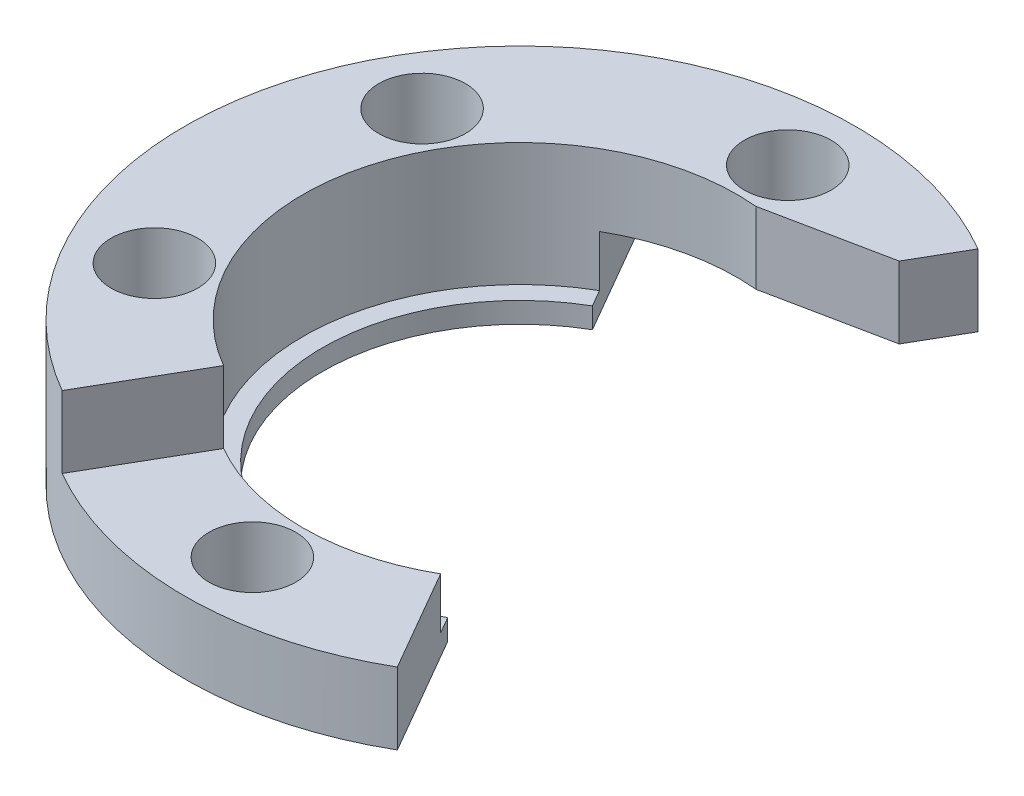
ISO-10303-21;
HEADER;
FILE_DESCRIPTION(('STEP AP214'),'2;1');
FILE_NAME('part.step','',(''),(''),'','','');
FILE_SCHEMA(('AUTOMOTIVE_DESIGN { 1 0 10303 214 1 1 1 1 }'));
ENDSEC;
DATA;
#1=APPLICATION_CONTEXT('core data for automotive mechanical design processes');
#2=APPLICATION_PROTOCOL_DEFINITION('international standard','automotive_design',2000,#1);
#3=PRODUCT_CONTEXT('',#1,'mechanical');
#4=PRODUCT('Part','Part','',(#3));
#5=PRODUCT_RELATED_PRODUCT_CATEGORY('part','',(#4));
#6=PRODUCT_DEFINITION_FORMATION('','',#4);
#7=PRODUCT_DEFINITION_CONTEXT('part definition',#1,'design');
#8=PRODUCT_DEFINITION('design','',#6,#7);
#9=PRODUCT_DEFINITION_SHAPE('','',#8);
#10=(LENGTH_UNIT() NAMED_UNIT(*) SI_UNIT(.MILLI.,.METRE.));
#11=(NAMED_UNIT(*) PLANE_ANGLE_UNIT() SI_UNIT($,.RADIAN.));
#12=(NAMED_UNIT(*) SI_UNIT($,.STERADIAN.) SOLID_ANGLE_UNIT());
#13=UNCERTAINTY_MEASURE_WITH_UNIT(LENGTH_MEASURE(1.E-05),#10,'distance_accuracy_value','');
#14=(GEOMETRIC_REPRESENTATION_CONTEXT(3) GLOBAL_UNCERTAINTY_ASSIGNED_CONTEXT((#13)) GLOBAL_UNIT_ASSIGNED_CONTEXT((#10,
#11,#12)) REPRESENTATION_CONTEXT('',''));
#15=CARTESIAN_POINT('',(0.,0.,0.));
#16=DIRECTION('',(0.,0.,1.));
#17=DIRECTION('',(1.,0.,0.));
#18=AXIS2_PLACEMENT_3D('',#15,#16,#17);
#19=CARTESIAN_POINT('',(0.,7.239,0.));
#20=DIRECTION('',(0.,-1.,0.));
#21=DIRECTION('',(0.,0.,-1.));
#22=AXIS2_PLACEMENT_3D('',#19,#20,#21);
#23=CYLINDRICAL_SURFACE('',#22,10.9347);
#24=DIRECTION('',(0.,-1.,0.));
#25=VECTOR('',#24,1.);
#26=CARTESIAN_POINT('',(0.998562219051619,7.239,-10.889009945109));
#27=LINE('',#26,#25);
#28=CARTESIAN_POINT('',(0.998562219051619,7.239,-10.889009945109));
#29=VERTEX_POINT('',#28);
#30=CARTESIAN_POINT('',(0.998562219051616,3.6195,-10.889009945109));
#31=VERTEX_POINT('',#30);
#32=EDGE_CURVE('E46',#29,#31,#27,.T.);
#33=ORIENTED_EDGE('',*,*,#32,.F.);
#34=CARTESIAN_POINT('',(0.,7.239,0.));
#35=DIRECTION('',(0.,-1.,0.));
#36=DIRECTION('',(0.,0.,-1.));
#37=AXIS2_PLACEMENT_3D('',#34,#35,#36);
#38=CIRCLE('',#37,10.9347);
#39=CARTESIAN_POINT('',(-5.46734999999996,7.239,9.46972798276173));
#40=VERTEX_POINT('',#39);
#41=EDGE_CURVE('E128',#40,#29,#38,.T.);
#42=ORIENTED_EDGE('',*,*,#41,.F.);
#43=DIRECTION('',(0.,-1.,0.));
#44=VECTOR('',#43,1.);
#45=CARTESIAN_POINT('',(-5.46734999999995,7.239,9.46972798276173));
#46=LINE('',#45,#44);
#47=CARTESIAN_POINT('',(-5.46734999999996,3.6195,9.46972798276173));
#48=VERTEX_POINT('',#47);
#49=EDGE_CURVE('E134',#40,#48,#46,.T.);
#50=ORIENTED_EDGE('',*,*,#49,.T.);
#51=CARTESIAN_POINT('',(0.,3.6195,0.));
#52=DIRECTION('',(0.,-1.,0.));
#53=DIRECTION('',(0.,0.,-1.));
#54=AXIS2_PLACEMENT_3D('',#51,#52,#53);
#55=CIRCLE('',#54,10.9347);
#56=CARTESIAN_POINT('',(5.46735,3.6195,9.46972798276172));
#57=VERTEX_POINT('',#56);
#58=EDGE_CURVE('E217',#48,#57,#55,.F.);
#59=ORIENTED_EDGE('',*,*,#58,.T.);
#60=DIRECTION('',(0.,-1.,0.));
#61=VECTOR('',#60,1.);
#62=CARTESIAN_POINT('',(5.46734999999998,7.239,9.46972798276172));
#63=LINE('',#62,#61);
#64=CARTESIAN_POINT('',(5.46734999999998,1.0414,9.46972798276172));
#65=VERTEX_POINT('',#64);
#66=EDGE_CURVE('E146',#57,#65,#63,.T.);
#67=ORIENTED_EDGE('',*,*,#66,.T.);
#68=CARTESIAN_POINT('',(0.,1.0414,0.));
#69=DIRECTION('',(0.,-1.,0.));
#70=DIRECTION('',(0.,0.,-1.));
#71=AXIS2_PLACEMENT_3D('',#68,#69,#70);
#72=CIRCLE('',#71,10.9347);
#73=CARTESIAN_POINT('',(-5.46734999999996,1.0414,-9.46972798276173));
#74=VERTEX_POINT('',#73);
#75=EDGE_CURVE('E180',#74,#65,#72,.F.);
#76=ORIENTED_EDGE('',*,*,#75,.F.);
#77=DIRECTION('',(0.,-1.,0.));
#78=VECTOR('',#77,1.);
#79=CARTESIAN_POINT('',(-5.46734999999996,7.239,-9.46972798276173));
#80=LINE('',#79,#78);
#81=CARTESIAN_POINT('',(-5.46734999999995,3.6195,-9.46972798276173));
#82=VERTEX_POINT('',#81);
#83=EDGE_CURVE('E232',#74,#82,#80,.F.);
#84=ORIENTED_EDGE('',*,*,#83,.T.);
#85=CARTESIAN_POINT('',(0.,3.6195,0.));
#86=DIRECTION('',(0.,1.,0.));
#87=DIRECTION('',(0.,0.,1.));
#88=AXIS2_PLACEMENT_3D('',#85,#86,#87);
#89=CIRCLE('',#88,10.9347);
#90=EDGE_CURVE('E235',#82,#31,#89,.F.);
#91=ORIENTED_EDGE('',*,*,#90,.T.);
#92=EDGE_LOOP('',(#33,#42,#50,#59,#67,#76,#84,#91));
#93=FACE_BOUND('',#92,.T.);
#94=ADVANCED_FACE('F31',(#93),#23,.F.);
#95=CARTESIAN_POINT('',(0.,7.239,0.));
#96=DIRECTION('',(0.,1.,0.));
#97=DIRECTION('',(0.,0.,1.));
#98=AXIS2_PLACEMENT_3D('',#95,#96,#97);
#99=PLANE('',#98);
#100=CARTESIAN_POINT('',(0.,7.239,-13.4874));
#101=DIRECTION('',(0.,1.,0.));
#102=DIRECTION('',(0.,0.,1.));
#103=AXIS2_PLACEMENT_3D('',#100,#101,#102);
#104=CIRCLE('',#103,2.1844);
#105=CARTESIAN_POINT('',(0.,7.239,-11.303));
#106=VERTEX_POINT('',#105);
#107=EDGE_CURVE('E167',#106,#106,#104,.T.);
#108=ORIENTED_EDGE('',*,*,#107,.F.);
#109=EDGE_LOOP('',(#108));
#110=FACE_BOUND('',#109,.T.);
#111=CARTESIAN_POINT('',(-11.6804310310023,7.239,6.74369999999989));
#112=DIRECTION('',(0.,1.,0.));
#113=DIRECTION('',(0.866025403784443,0.,-0.499999999999992));
#114=AXIS2_PLACEMENT_3D('',#111,#112,#113);
#115=CIRCLE('',#114,2.1844);
#116=CARTESIAN_POINT('',(-9.78868513897556,7.239,5.65149999999991));
#117=VERTEX_POINT('',#116);
#118=EDGE_CURVE('E156',#117,#117,#115,.T.);
#119=ORIENTED_EDGE('',*,*,#118,.F.);
#120=EDGE_LOOP('',(#119));
#121=FACE_BOUND('',#120,.T.);
#122=CARTESIAN_POINT('',(-11.6804310310022,7.239,-6.74370000000014));
#123=DIRECTION('',(0.,1.,0.));
#124=DIRECTION('',(0.866025403784433,0.,0.50000000000001));
#125=AXIS2_PLACEMENT_3D('',#122,#123,#124);
#126=CIRCLE('',#125,2.1844);
#127=CARTESIAN_POINT('',(-9.78868513897544,7.239,-5.65150000000011));
#128=VERTEX_POINT('',#127);
#129=EDGE_CURVE('E152',#128,#128,#126,.T.);
#130=ORIENTED_EDGE('',*,*,#129,.F.);
#131=EDGE_LOOP('',(#130));
#132=FACE_BOUND('',#131,.T.);
#133=ORIENTED_EDGE('',*,*,#41,.T.);
#134=DIRECTION('',(-0.979825430133673,0.,0.199855263786978));
#135=VECTOR('',#134,1.);
#136=CARTESIAN_POINT('',(0.998562219051619,7.239,-10.889009945109));
#137=LINE('',#136,#135);
#138=CARTESIAN_POINT('',(6.9926503971512,7.239,-12.1116257674326));
#139=VERTEX_POINT('',#138);
#140=EDGE_CURVE('E114',#139,#29,#137,.T.);
#141=ORIENTED_EDGE('',*,*,#140,.F.);
#142=DIRECTION('',(-0.499999999999998,0.,0.86602540378444));
#143=VECTOR('',#142,1.);
#144=CARTESIAN_POINT('',(0.,7.239,0.));
#145=LINE('',#144,#143);
#146=CARTESIAN_POINT('',(8.44549999999997,7.239,-14.628035095323));
#147=VERTEX_POINT('',#146);
#148=EDGE_CURVE('E124',#147,#139,#145,.T.);
#149=ORIENTED_EDGE('',*,*,#148,.F.);
#150=CARTESIAN_POINT('',(0.,7.239,0.));
#151=DIRECTION('',(0.,1.,0.));
#152=DIRECTION('',(0.,0.,1.));
#153=AXIS2_PLACEMENT_3D('',#150,#151,#152);
#154=CIRCLE('',#153,16.891);
#155=CARTESIAN_POINT('',(-8.44549999999993,7.239,14.628035095323));
#156=VERTEX_POINT('',#155);
#157=EDGE_CURVE('E178',#147,#156,#154,.T.);
#158=ORIENTED_EDGE('',*,*,#157,.T.);
#159=DIRECTION('',(-0.499999999999996,0.,0.866025403784441));
#160=VECTOR('',#159,1.);
#161=CARTESIAN_POINT('',(-9.75202339688186,7.239,16.891));
#162=LINE('',#161,#160);
#163=EDGE_CURVE('E228',#40,#156,#162,.T.);
#164=ORIENTED_EDGE('',*,*,#163,.F.);
#165=EDGE_LOOP('',(#133,#141,#149,#158,#164));
#166=FACE_BOUND('',#165,.T.);
#167=ADVANCED_FACE('F122',(#110,#121,#132,#166),#99,.T.);
#168=CARTESIAN_POINT('',(0.,0.,0.));
#169=DIRECTION('',(-0.86602540378444,0.,-0.499999999999998));
#170=DIRECTION('',(-0.499999999999998,0.,0.86602540378444));
#171=AXIS2_PLACEMENT_3D('',#168,#169,#170);
#172=PLANE('',#171);
#173=DIRECTION('',(0.,-1.,0.));
#174=VECTOR('',#173,1.);
#175=CARTESIAN_POINT('',(6.9926503971512,7.239,-12.1116257674326));
#176=LINE('',#175,#174);
#177=CARTESIAN_POINT('',(6.9926503971512,3.6195,-12.1116257674326));
#178=VERTEX_POINT('',#177);
#179=EDGE_CURVE('E111',#139,#178,#176,.T.);
#180=ORIENTED_EDGE('',*,*,#179,.T.);
#181=DIRECTION('',(0.499999999999998,0.,-0.86602540378444));
#182=VECTOR('',#181,1.);
#183=CARTESIAN_POINT('',(0.,3.6195,0.));
#184=LINE('',#183,#182);
#185=CARTESIAN_POINT('',(8.44549999999997,3.6195,-14.628035095323));
#186=VERTEX_POINT('',#185);
#187=EDGE_CURVE('E39',#178,#186,#184,.T.);
#188=ORIENTED_EDGE('',*,*,#187,.T.);
#189=DIRECTION('',(0.,-1.,0.));
#190=VECTOR('',#189,1.);
#191=CARTESIAN_POINT('',(8.44549999999997,7.239,-14.628035095323));
#192=LINE('',#191,#190);
#193=EDGE_CURVE('E132',#147,#186,#192,.T.);
#194=ORIENTED_EDGE('',*,*,#193,.F.);
#195=ORIENTED_EDGE('',*,*,#148,.T.);
#196=EDGE_LOOP('',(#180,#188,#194,#195));
#197=FACE_BOUND('',#196,.T.);
#198=ADVANCED_FACE('F130',(#197),#172,.F.);
#199=CARTESIAN_POINT('',(0.,3.6195,0.));
#200=DIRECTION('',(0.,1.,0.));
#201=DIRECTION('',(0.,0.,1.));
#202=AXIS2_PLACEMENT_3D('',#199,#200,#201);
#203=PLANE('',#202);
#204=CARTESIAN_POINT('',(0.,3.6195,-13.4874));
#205=DIRECTION('',(0.,1.,0.));
#206=DIRECTION('',(0.,0.,1.));
#207=AXIS2_PLACEMENT_3D('',#204,#205,#206);
#208=CIRCLE('',#207,2.1844);
#209=CARTESIAN_POINT('',(0.,3.6195,-11.303));
#210=VERTEX_POINT('',#209);
#211=EDGE_CURVE('E240',#210,#210,#208,.F.);
#212=ORIENTED_EDGE('',*,*,#211,.F.);
#213=EDGE_LOOP('',(#212));
#214=FACE_BOUND('',#213,.T.);
#215=DIRECTION('',(-0.979825430133673,0.,0.199855263786978));
#216=VECTOR('',#215,1.);
#217=CARTESIAN_POINT('',(0.998562219051619,3.6195,-10.889009945109));
#218=LINE('',#217,#216);
#219=EDGE_CURVE('E115',#178,#31,#218,.T.);
#220=ORIENTED_EDGE('',*,*,#219,.T.);
#221=ORIENTED_EDGE('',*,*,#90,.F.);
#222=DIRECTION('',(-0.499999999999996,0.,-0.866025403784441));
#223=VECTOR('',#222,1.);
#224=CARTESIAN_POINT('',(-9.75202339688186,3.6195,-16.891));
#225=LINE('',#224,#223);
#226=CARTESIAN_POINT('',(-8.44549999999993,3.6195,-14.628035095323));
#227=VERTEX_POINT('',#226);
#228=EDGE_CURVE('E243',#82,#227,#225,.T.);
#229=ORIENTED_EDGE('',*,*,#228,.T.);
#230=CARTESIAN_POINT('',(0.,3.6195,0.));
#231=DIRECTION('',(0.,1.,0.));
#232=DIRECTION('',(0.,0.,1.));
#233=AXIS2_PLACEMENT_3D('',#230,#231,#232);
#234=CIRCLE('',#233,16.891);
#235=EDGE_CURVE('E238',#186,#227,#234,.T.);
#236=ORIENTED_EDGE('',*,*,#235,.F.);
#237=ORIENTED_EDGE('',*,*,#187,.F.);
#238=EDGE_LOOP('',(#220,#221,#229,#236,#237));
#239=FACE_BOUND('',#238,.T.);
#240=ADVANCED_FACE('F249',(#214,#239),#203,.F.);
#241=CARTESIAN_POINT('',(0.,7.239,0.));
#242=DIRECTION('',(0.,-1.,0.));
#243=DIRECTION('',(0.,0.,-1.));
#244=AXIS2_PLACEMENT_3D('',#241,#242,#243);
#245=CYLINDRICAL_SURFACE('',#244,16.891);
#246=ORIENTED_EDGE('',*,*,#235,.T.);
#247=DIRECTION('',(0.,-1.,0.));
#248=VECTOR('',#247,1.);
#249=CARTESIAN_POINT('',(-8.44549999999993,7.239,-14.628035095323));
#250=LINE('',#249,#248);
#251=CARTESIAN_POINT('',(-8.44549999999993,0.,-14.628035095323));
#252=VERTEX_POINT('',#251);
#253=EDGE_CURVE('E202',#227,#252,#250,.T.);
#254=ORIENTED_EDGE('',*,*,#253,.T.);
#255=CARTESIAN_POINT('',(0.,0.,0.));
#256=DIRECTION('',(0.,1.,0.));
#257=DIRECTION('',(0.,0.,1.));
#258=AXIS2_PLACEMENT_3D('',#255,#256,#257);
#259=CIRCLE('',#258,16.891);
#260=CARTESIAN_POINT('',(8.44549999999997,0.,14.628035095323));
#261=VERTEX_POINT('',#260);
#262=EDGE_CURVE('E177',#252,#261,#259,.T.);
#263=ORIENTED_EDGE('',*,*,#262,.T.);
#264=DIRECTION('',(0.,-1.,0.));
#265=VECTOR('',#264,1.);
#266=CARTESIAN_POINT('',(8.44549999999997,7.239,14.628035095323));
#267=LINE('',#266,#265);
#268=CARTESIAN_POINT('',(8.44549999999997,3.6195,14.628035095323));
#269=VERTEX_POINT('',#268);
#270=EDGE_CURVE('E149',#261,#269,#267,.F.);
#271=ORIENTED_EDGE('',*,*,#270,.T.);
#272=CARTESIAN_POINT('',(0.,3.6195,0.));
#273=DIRECTION('',(0.,-1.,0.));
#274=DIRECTION('',(0.,0.,-1.));
#275=AXIS2_PLACEMENT_3D('',#272,#273,#274);
#276=CIRCLE('',#275,16.891);
#277=CARTESIAN_POINT('',(-8.44549999999993,3.6195,14.628035095323));
#278=VERTEX_POINT('',#277);
#279=EDGE_CURVE('E197',#269,#278,#276,.T.);
#280=ORIENTED_EDGE('',*,*,#279,.T.);
#281=DIRECTION('',(0.,-1.,0.));
#282=VECTOR('',#281,1.);
#283=CARTESIAN_POINT('',(-8.44549999999993,7.239,14.628035095323));
#284=LINE('',#283,#282);
#285=EDGE_CURVE('E139',#278,#156,#284,.F.);
#286=ORIENTED_EDGE('',*,*,#285,.T.);
#287=ORIENTED_EDGE('',*,*,#157,.F.);
#288=ORIENTED_EDGE('',*,*,#193,.T.);
#289=EDGE_LOOP('',(#246,#254,#263,#271,#280,#286,#287,#288));
#290=FACE_BOUND('',#289,.T.);
#291=ADVANCED_FACE('F33',(#290),#245,.T.);
#292=CARTESIAN_POINT('',(0.,0.,0.));
#293=DIRECTION('',(0.,1.,0.));
#294=DIRECTION('',(0.,0.,1.));
#295=AXIS2_PLACEMENT_3D('',#292,#293,#294);
#296=PLANE('',#295);
#297=CARTESIAN_POINT('',(-11.6804310310022,0.,-6.74370000000014));
#298=DIRECTION('',(0.,1.,0.));
#299=DIRECTION('',(0.866025403784433,0.,0.50000000000001));
#300=AXIS2_PLACEMENT_3D('',#297,#298,#299);
#301=CIRCLE('',#300,2.1844);
#302=CARTESIAN_POINT('',(-9.78868513897544,0.,-5.65150000000011));
#303=VERTEX_POINT('',#302);
#304=EDGE_CURVE('E153',#303,#303,#301,.T.);
#305=ORIENTED_EDGE('',*,*,#304,.T.);
#306=EDGE_LOOP('',(#305));
#307=FACE_BOUND('',#306,.T.);
#308=CARTESIAN_POINT('',(-11.6804310310023,0.,6.74369999999989));
#309=DIRECTION('',(0.,1.,0.));
#310=DIRECTION('',(0.866025403784443,0.,-0.499999999999992));
#311=AXIS2_PLACEMENT_3D('',#308,#309,#310);
#312=CIRCLE('',#311,2.1844);
#313=CARTESIAN_POINT('',(-9.78868513897556,0.,5.65149999999991));
#314=VERTEX_POINT('',#313);
#315=EDGE_CURVE('E159',#314,#314,#312,.T.);
#316=ORIENTED_EDGE('',*,*,#315,.T.);
#317=EDGE_LOOP('',(#316));
#318=FACE_BOUND('',#317,.T.);
#319=CARTESIAN_POINT('',(0.,0.,13.4874));
#320=DIRECTION('',(0.,1.,0.));
#321=DIRECTION('',(0.,0.,-1.));
#322=AXIS2_PLACEMENT_3D('',#319,#320,#321);
#323=CIRCLE('',#322,2.1844);
#324=CARTESIAN_POINT('',(0.,0.,11.303));
#325=VERTEX_POINT('',#324);
#326=EDGE_CURVE('E162',#325,#325,#323,.T.);
#327=ORIENTED_EDGE('',*,*,#326,.T.);
#328=EDGE_LOOP('',(#327));
#329=FACE_BOUND('',#328,.T.);
#330=ORIENTED_EDGE('',*,*,#262,.F.);
#331=DIRECTION('',(-0.499999999999996,0.,-0.866025403784441));
#332=VECTOR('',#331,1.);
#333=CARTESIAN_POINT('',(-9.75202339688186,0.,-16.891));
#334=LINE('',#333,#332);
#335=CARTESIAN_POINT('',(-4.97839999999996,0.,-8.62284174040093));
#336=VERTEX_POINT('',#335);
#337=EDGE_CURVE('E117',#336,#252,#334,.T.);
#338=ORIENTED_EDGE('',*,*,#337,.F.);
#339=CARTESIAN_POINT('',(0.,0.,0.));
#340=DIRECTION('',(0.,-1.,0.));
#341=DIRECTION('',(0.,0.,-1.));
#342=AXIS2_PLACEMENT_3D('',#339,#340,#341);
#343=CIRCLE('',#342,9.9568);
#344=CARTESIAN_POINT('',(4.97839999999998,0.,8.62284174040091));
#345=VERTEX_POINT('',#344);
#346=EDGE_CURVE('E170',#345,#336,#343,.T.);
#347=ORIENTED_EDGE('',*,*,#346,.F.);
#348=DIRECTION('',(0.499999999999998,0.,0.86602540378444));
#349=VECTOR('',#348,1.);
#350=CARTESIAN_POINT('',(0.,0.,0.));
#351=LINE('',#350,#349);
#352=EDGE_CURVE('E133',#345,#261,#351,.T.);
#353=ORIENTED_EDGE('',*,*,#352,.T.);
#354=EDGE_LOOP('',(#330,#338,#347,#353));
#355=FACE_BOUND('',#354,.T.);
#356=ADVANCED_FACE('F205',(#307,#318,#329,#355),#296,.F.);
#357=CARTESIAN_POINT('',(0.,1.0414,0.));
#358=DIRECTION('',(0.,-1.,0.));
#359=DIRECTION('',(0.,0.,-1.));
#360=AXIS2_PLACEMENT_3D('',#357,#358,#359);
#361=PLANE('',#360);
#362=CARTESIAN_POINT('',(0.,1.0414,0.));
#363=DIRECTION('',(0.,-1.,0.));
#364=DIRECTION('',(0.,0.,-1.));
#365=AXIS2_PLACEMENT_3D('',#362,#363,#364);
#366=CIRCLE('',#365,9.9568);
#367=CARTESIAN_POINT('',(4.97839999999998,1.0414,8.62284174040091));
#368=VERTEX_POINT('',#367);
#369=CARTESIAN_POINT('',(-4.97839999999996,1.0414,-8.62284174040093));
#370=VERTEX_POINT('',#369);
#371=EDGE_CURVE('E171',#368,#370,#366,.T.);
#372=ORIENTED_EDGE('',*,*,#371,.T.);
#373=DIRECTION('',(-0.499999999999996,0.,-0.866025403784441));
#374=VECTOR('',#373,1.);
#375=CARTESIAN_POINT('',(0.,1.0414,0.));
#376=LINE('',#375,#374);
#377=EDGE_CURVE('E213',#370,#74,#376,.T.);
#378=ORIENTED_EDGE('',*,*,#377,.T.);
#379=ORIENTED_EDGE('',*,*,#75,.T.);
#380=DIRECTION('',(-0.499999999999998,0.,-0.86602540378444));
#381=VECTOR('',#380,1.);
#382=CARTESIAN_POINT('',(0.,1.0414,0.));
#383=LINE('',#382,#381);
#384=EDGE_CURVE('E143',#65,#368,#383,.T.);
#385=ORIENTED_EDGE('',*,*,#384,.T.);
#386=EDGE_LOOP('',(#372,#378,#379,#385));
#387=FACE_BOUND('',#386,.T.);
#388=ADVANCED_FACE('F212',(#387),#361,.F.);
#389=CARTESIAN_POINT('',(0.,1.0414,0.));
#390=DIRECTION('',(0.,-1.,0.));
#391=DIRECTION('',(0.,0.,-1.));
#392=AXIS2_PLACEMENT_3D('',#389,#390,#391);
#393=CYLINDRICAL_SURFACE('',#392,9.9568);
#394=ORIENTED_EDGE('',*,*,#346,.T.);
#395=DIRECTION('',(0.,-1.,0.));
#396=VECTOR('',#395,1.);
#397=CARTESIAN_POINT('',(-4.97839999999996,1.0414,-8.62284174040093));
#398=LINE('',#397,#396);
#399=EDGE_CURVE('E11',#336,#370,#398,.F.);
#400=ORIENTED_EDGE('',*,*,#399,.T.);
#401=ORIENTED_EDGE('',*,*,#371,.F.);
#402=DIRECTION('',(0.,-1.,0.));
#403=VECTOR('',#402,1.);
#404=CARTESIAN_POINT('',(4.97839999999998,1.0414,8.62284174040091));
#405=LINE('',#404,#403);
#406=EDGE_CURVE('E183',#368,#345,#405,.T.);
#407=ORIENTED_EDGE('',*,*,#406,.T.);
#408=EDGE_LOOP('',(#394,#400,#401,#407));
#409=FACE_BOUND('',#408,.T.);
#410=ADVANCED_FACE('F209',(#409),#393,.F.);
#411=CARTESIAN_POINT('',(0.,0.,-13.4874));
#412=DIRECTION('',(0.,1.,0.));
#413=DIRECTION('',(0.,0.,1.));
#414=AXIS2_PLACEMENT_3D('',#411,#412,#413);
#415=CYLINDRICAL_SURFACE('',#414,2.1844);
#416=ORIENTED_EDGE('',*,*,#211,.T.);
#417=EDGE_LOOP('',(#416));
#418=FACE_BOUND('',#417,.T.);
#419=ORIENTED_EDGE('',*,*,#107,.T.);
#420=EDGE_LOOP('',(#419));
#421=FACE_BOUND('',#420,.T.);
#422=ADVANCED_FACE('F290',(#418,#421),#415,.F.);
#423=CARTESIAN_POINT('',(0.,0.,13.4874));
#424=DIRECTION('',(0.,1.,0.));
#425=DIRECTION('',(0.,0.,1.));
#426=AXIS2_PLACEMENT_3D('',#423,#424,#425);
#427=CYLINDRICAL_SURFACE('',#426,2.1844);
#428=CARTESIAN_POINT('',(0.,3.6195,13.4874));
#429=DIRECTION('',(0.,-1.,0.));
#430=DIRECTION('',(0.,0.,-1.));
#431=AXIS2_PLACEMENT_3D('',#428,#429,#430);
#432=CIRCLE('',#431,2.1844);
#433=CARTESIAN_POINT('',(0.,3.6195,11.303));
#434=VERTEX_POINT('',#433);
#435=EDGE_CURVE('E222',#434,#434,#432,.F.);
#436=ORIENTED_EDGE('',*,*,#435,.T.);
#437=EDGE_LOOP('',(#436));
#438=FACE_BOUND('',#437,.T.);
#439=ORIENTED_EDGE('',*,*,#326,.F.);
#440=EDGE_LOOP('',(#439));
#441=FACE_BOUND('',#440,.T.);
#442=ADVANCED_FACE('F287',(#438,#441),#427,.F.);
#443=CARTESIAN_POINT('',(-11.6804310310023,0.,6.74369999999989));
#444=DIRECTION('',(0.,1.,0.));
#445=DIRECTION('',(0.,0.,1.));
#446=AXIS2_PLACEMENT_3D('',#443,#444,#445);
#447=CYLINDRICAL_SURFACE('',#446,2.1844);
#448=ORIENTED_EDGE('',*,*,#315,.F.);
#449=EDGE_LOOP('',(#448));
#450=FACE_BOUND('',#449,.T.);
#451=ORIENTED_EDGE('',*,*,#118,.T.);
#452=EDGE_LOOP('',(#451));
#453=FACE_BOUND('',#452,.T.);
#454=ADVANCED_FACE('F289',(#450,#453),#447,.F.);
#455=CARTESIAN_POINT('',(-11.6804310310022,0.,-6.74370000000014));
#456=DIRECTION('',(0.,1.,0.));
#457=DIRECTION('',(0.,0.,1.));
#458=AXIS2_PLACEMENT_3D('',#455,#456,#457);
#459=CYLINDRICAL_SURFACE('',#458,2.1844);
#460=ORIENTED_EDGE('',*,*,#304,.F.);
#461=EDGE_LOOP('',(#460));
#462=FACE_BOUND('',#461,.T.);
#463=ORIENTED_EDGE('',*,*,#129,.T.);
#464=EDGE_LOOP('',(#463));
#465=FACE_BOUND('',#464,.T.);
#466=ADVANCED_FACE('F297',(#462,#465),#459,.F.);
#467=CARTESIAN_POINT('',(0.,0.,0.));
#468=DIRECTION('',(-0.86602540378444,0.,0.499999999999998));
#469=DIRECTION('',(0.499999999999998,0.,0.86602540378444));
#470=AXIS2_PLACEMENT_3D('',#467,#468,#469);
#471=PLANE('',#470);
#472=ORIENTED_EDGE('',*,*,#66,.F.);
#473=DIRECTION('',(0.499999999999998,0.,0.86602540378444));
#474=VECTOR('',#473,1.);
#475=CARTESIAN_POINT('',(0.,3.6195,0.));
#476=LINE('',#475,#474);
#477=EDGE_CURVE('E186',#57,#269,#476,.T.);
#478=ORIENTED_EDGE('',*,*,#477,.T.);
#479=ORIENTED_EDGE('',*,*,#270,.F.);
#480=ORIENTED_EDGE('',*,*,#352,.F.);
#481=ORIENTED_EDGE('',*,*,#406,.F.);
#482=ORIENTED_EDGE('',*,*,#384,.F.);
#483=EDGE_LOOP('',(#472,#478,#479,#480,#481,#482));
#484=FACE_BOUND('',#483,.T.);
#485=ADVANCED_FACE('F191',(#484),#471,.F.);
#486=CARTESIAN_POINT('',(-9.75202339688186,3.6195,16.891));
#487=DIRECTION('',(-0.866025403784441,0.,-0.499999999999996));
#488=DIRECTION('',(-0.499999999999996,0.,0.866025403784441));
#489=AXIS2_PLACEMENT_3D('',#486,#487,#488);
#490=PLANE('',#489);
#491=ORIENTED_EDGE('',*,*,#163,.T.);
#492=ORIENTED_EDGE('',*,*,#285,.F.);
#493=DIRECTION('',(-0.499999999999996,0.,0.866025403784441));
#494=VECTOR('',#493,1.);
#495=CARTESIAN_POINT('',(-9.75202339688186,3.6195,16.891));
#496=LINE('',#495,#494);
#497=EDGE_CURVE('E227',#48,#278,#496,.T.);
#498=ORIENTED_EDGE('',*,*,#497,.F.);
#499=ORIENTED_EDGE('',*,*,#49,.F.);
#500=EDGE_LOOP('',(#491,#492,#498,#499));
#501=FACE_BOUND('',#500,.T.);
#502=ADVANCED_FACE('F254',(#501),#490,.F.);
#503=CARTESIAN_POINT('',(0.,3.6195,0.));
#504=DIRECTION('',(0.,-1.,0.));
#505=DIRECTION('',(0.,0.,-1.));
#506=AXIS2_PLACEMENT_3D('',#503,#504,#505);
#507=PLANE('',#506);
#508=ORIENTED_EDGE('',*,*,#435,.F.);
#509=EDGE_LOOP('',(#508));
#510=FACE_BOUND('',#509,.T.);
#511=ORIENTED_EDGE('',*,*,#497,.T.);
#512=ORIENTED_EDGE('',*,*,#279,.F.);
#513=ORIENTED_EDGE('',*,*,#477,.F.);
#514=ORIENTED_EDGE('',*,*,#58,.F.);
#515=EDGE_LOOP('',(#511,#512,#513,#514));
#516=FACE_BOUND('',#515,.T.);
#517=ADVANCED_FACE('F255',(#510,#516),#507,.F.);
#518=CARTESIAN_POINT('',(-9.75202339688186,3.6195,-16.891));
#519=DIRECTION('',(-0.866025403784441,0.,0.499999999999996));
#520=DIRECTION('',(0.499999999999996,0.,0.866025403784441));
#521=AXIS2_PLACEMENT_3D('',#518,#519,#520);
#522=PLANE('',#521);
#523=ORIENTED_EDGE('',*,*,#228,.F.);
#524=ORIENTED_EDGE('',*,*,#83,.F.);
#525=ORIENTED_EDGE('',*,*,#377,.F.);
#526=ORIENTED_EDGE('',*,*,#399,.F.);
#527=ORIENTED_EDGE('',*,*,#337,.T.);
#528=ORIENTED_EDGE('',*,*,#253,.F.);
#529=EDGE_LOOP('',(#523,#524,#525,#526,#527,#528));
#530=FACE_BOUND('',#529,.T.);
#531=ADVANCED_FACE('F252',(#530),#522,.F.);
#532=CARTESIAN_POINT('',(0.998562219051619,7.239,-10.889009945109));
#533=DIRECTION('',(0.199855263786978,0.,0.979825430133673));
#534=DIRECTION('',(0.979825430133673,0.,-0.199855263786978));
#535=AXIS2_PLACEMENT_3D('',#532,#533,#534);
#536=PLANE('',#535);
#537=ORIENTED_EDGE('',*,*,#219,.F.);
#538=ORIENTED_EDGE('',*,*,#179,.F.);
#539=ORIENTED_EDGE('',*,*,#140,.T.);
#540=ORIENTED_EDGE('',*,*,#32,.T.);
#541=EDGE_LOOP('',(#537,#538,#539,#540));
#542=FACE_BOUND('',#541,.T.);
#543=ADVANCED_FACE('F113',(#542),#536,.T.);
#544=CLOSED_SHELL('',(#94,#167,#198,#240,#291,#356,#388,#410,#422,#442,#454,#466,#485,#502,#517,
#531,#543));
#545=MANIFOLD_SOLID_BREP('B2',#544);
#546=ADVANCED_BREP_SHAPE_REPRESENTATION('',(#18,#545),#14);
#547=SHAPE_DEFINITION_REPRESENTATION(#9,#546);
ENDSEC;
END-ISO-10303-21;
